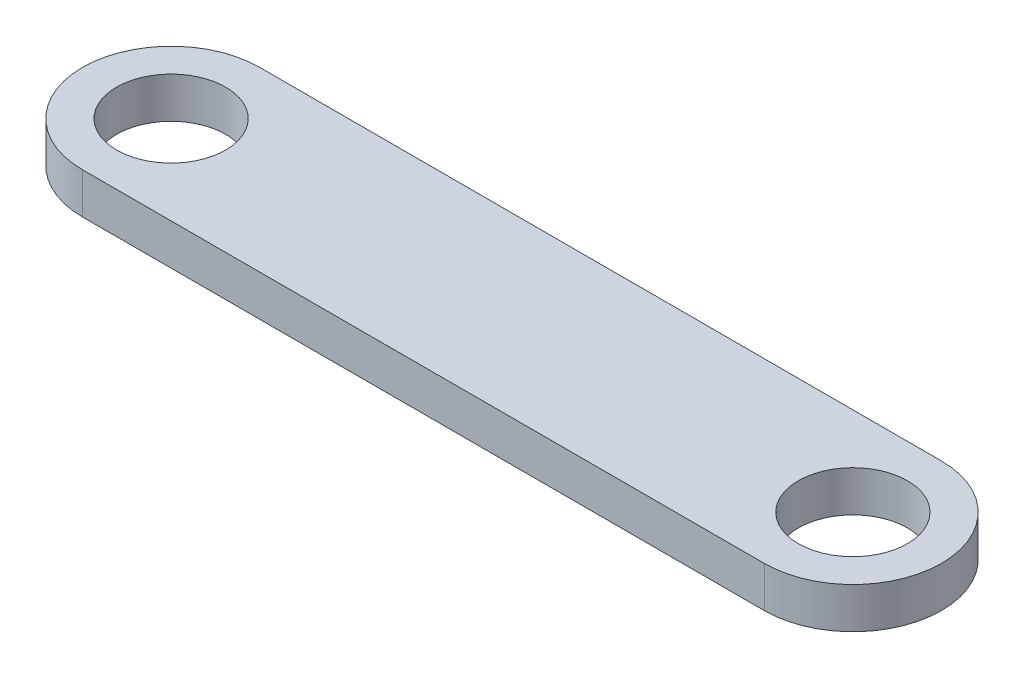
ISO-10303-21;
HEADER;
FILE_DESCRIPTION(('STEP AP214'),'2;1');
FILE_NAME('part.step','',(''),(''),'','','');
FILE_SCHEMA(('AUTOMOTIVE_DESIGN { 1 0 10303 214 1 1 1 1 }'));
ENDSEC;
DATA;
#1=APPLICATION_CONTEXT('core data for automotive mechanical design processes');
#2=APPLICATION_PROTOCOL_DEFINITION('international standard','automotive_design',2000,#1);
#3=PRODUCT_CONTEXT('',#1,'mechanical');
#4=PRODUCT('Part','Part','',(#3));
#5=PRODUCT_RELATED_PRODUCT_CATEGORY('part','',(#4));
#6=PRODUCT_DEFINITION_FORMATION('','',#4);
#7=PRODUCT_DEFINITION_CONTEXT('part definition',#1,'design');
#8=PRODUCT_DEFINITION('design','',#6,#7);
#9=PRODUCT_DEFINITION_SHAPE('','',#8);
#10=(LENGTH_UNIT() NAMED_UNIT(*) SI_UNIT(.MILLI.,.METRE.));
#11=(NAMED_UNIT(*) PLANE_ANGLE_UNIT() SI_UNIT($,.RADIAN.));
#12=(NAMED_UNIT(*) SI_UNIT($,.STERADIAN.) SOLID_ANGLE_UNIT());
#13=UNCERTAINTY_MEASURE_WITH_UNIT(LENGTH_MEASURE(1.E-05),#10,'distance_accuracy_value','');
#14=(GEOMETRIC_REPRESENTATION_CONTEXT(3) GLOBAL_UNCERTAINTY_ASSIGNED_CONTEXT((#13)) GLOBAL_UNIT_ASSIGNED_CONTEXT((#10,
#11,#12)) REPRESENTATION_CONTEXT('',''));
#15=CARTESIAN_POINT('',(0.,0.,0.));
#16=DIRECTION('',(0.,0.,1.));
#17=DIRECTION('',(1.,0.,0.));
#18=AXIS2_PLACEMENT_3D('',#15,#16,#17);
#19=CARTESIAN_POINT('',(-25.,3.,0.));
#20=DIRECTION('',(0.,1.,0.));
#21=DIRECTION('',(0.,0.,1.));
#22=AXIS2_PLACEMENT_3D('',#19,#20,#21);
#23=PLANE('',#22);
#24=CARTESIAN_POINT('',(-25.,3.,0.));
#25=DIRECTION('',(0.,1.,0.));
#26=DIRECTION('',(0.,0.,1.));
#27=AXIS2_PLACEMENT_3D('',#24,#25,#26);
#28=CIRCLE('',#27,4.);
#29=CARTESIAN_POINT('',(-25.,3.,4.));
#30=VERTEX_POINT('',#29);
#31=EDGE_CURVE('E118',#30,#30,#28,.T.);
#32=ORIENTED_EDGE('',*,*,#31,.F.);
#33=EDGE_LOOP('',(#32));
#34=FACE_BOUND('',#33,.T.);
#35=CARTESIAN_POINT('',(-25.,3.,0.));
#36=DIRECTION('',(0.,1.,0.));
#37=DIRECTION('',(0.,0.,1.));
#38=AXIS2_PLACEMENT_3D('',#35,#36,#37);
#39=CIRCLE('',#38,6.5);
#40=CARTESIAN_POINT('',(-25.,3.,-6.5));
#41=VERTEX_POINT('',#40);
#42=CARTESIAN_POINT('',(-25.,3.,6.5));
#43=VERTEX_POINT('',#42);
#44=EDGE_CURVE('E98',#41,#43,#39,.T.);
#45=ORIENTED_EDGE('',*,*,#44,.T.);
#46=DIRECTION('',(1.,0.,0.));
#47=VECTOR('',#46,1.);
#48=CARTESIAN_POINT('',(-25.,3.,6.5));
#49=LINE('',#48,#47);
#50=CARTESIAN_POINT('',(25.,3.,6.49999999999999));
#51=VERTEX_POINT('',#50);
#52=EDGE_CURVE('E93',#43,#51,#49,.T.);
#53=ORIENTED_EDGE('',*,*,#52,.T.);
#54=CARTESIAN_POINT('',(25.,3.,0.));
#55=DIRECTION('',(0.,1.,0.));
#56=DIRECTION('',(0.,0.,1.));
#57=AXIS2_PLACEMENT_3D('',#54,#55,#56);
#58=CIRCLE('',#57,6.5);
#59=CARTESIAN_POINT('',(25.,3.,-6.50000000000001));
#60=VERTEX_POINT('',#59);
#61=EDGE_CURVE('E96',#51,#60,#58,.T.);
#62=ORIENTED_EDGE('',*,*,#61,.T.);
#63=DIRECTION('',(-1.,0.,0.));
#64=VECTOR('',#63,1.);
#65=CARTESIAN_POINT('',(-25.,3.,-6.5));
#66=LINE('',#65,#64);
#67=EDGE_CURVE('E63',#60,#41,#66,.T.);
#68=ORIENTED_EDGE('',*,*,#67,.T.);
#69=EDGE_LOOP('',(#45,#53,#62,#68));
#70=FACE_BOUND('',#69,.T.);
#71=CARTESIAN_POINT('',(25.,3.,0.));
#72=DIRECTION('',(0.,1.,0.));
#73=DIRECTION('',(0.,0.,1.));
#74=AXIS2_PLACEMENT_3D('',#71,#72,#73);
#75=CIRCLE('',#74,4.);
#76=CARTESIAN_POINT('',(25.,3.,3.99999999999999));
#77=VERTEX_POINT('',#76);
#78=EDGE_CURVE('E140',#77,#77,#75,.T.);
#79=ORIENTED_EDGE('',*,*,#78,.F.);
#80=EDGE_LOOP('',(#79));
#81=FACE_BOUND('',#80,.T.);
#82=ADVANCED_FACE('F45',(#34,#70,#81),#23,.T.);
#83=CARTESIAN_POINT('',(-25.,0.,0.));
#84=DIRECTION('',(0.,1.,0.));
#85=DIRECTION('',(0.,0.,1.));
#86=AXIS2_PLACEMENT_3D('',#83,#84,#85);
#87=PLANE('',#86);
#88=CARTESIAN_POINT('',(-25.,0.,0.));
#89=DIRECTION('',(0.,1.,0.));
#90=DIRECTION('',(0.,0.,1.));
#91=AXIS2_PLACEMENT_3D('',#88,#89,#90);
#92=CIRCLE('',#91,6.5);
#93=CARTESIAN_POINT('',(-25.,0.,-6.5));
#94=VERTEX_POINT('',#93);
#95=CARTESIAN_POINT('',(-25.,0.,6.5));
#96=VERTEX_POINT('',#95);
#97=EDGE_CURVE('E114',#94,#96,#92,.T.);
#98=ORIENTED_EDGE('',*,*,#97,.F.);
#99=DIRECTION('',(-1.,0.,0.));
#100=VECTOR('',#99,1.);
#101=CARTESIAN_POINT('',(-25.,0.,-6.5));
#102=LINE('',#101,#100);
#103=CARTESIAN_POINT('',(25.,0.,-6.50000000000001));
#104=VERTEX_POINT('',#103);
#105=EDGE_CURVE('E86',#104,#94,#102,.T.);
#106=ORIENTED_EDGE('',*,*,#105,.F.);
#107=CARTESIAN_POINT('',(25.,0.,0.));
#108=DIRECTION('',(0.,1.,0.));
#109=DIRECTION('',(0.,0.,1.));
#110=AXIS2_PLACEMENT_3D('',#107,#108,#109);
#111=CIRCLE('',#110,6.5);
#112=CARTESIAN_POINT('',(25.,0.,6.49999999999999));
#113=VERTEX_POINT('',#112);
#114=EDGE_CURVE('E80',#113,#104,#111,.T.);
#115=ORIENTED_EDGE('',*,*,#114,.F.);
#116=DIRECTION('',(1.,0.,0.));
#117=VECTOR('',#116,1.);
#118=CARTESIAN_POINT('',(-25.,0.,6.5));
#119=LINE('',#118,#117);
#120=EDGE_CURVE('E103',#96,#113,#119,.T.);
#121=ORIENTED_EDGE('',*,*,#120,.F.);
#122=EDGE_LOOP('',(#98,#106,#115,#121));
#123=FACE_BOUND('',#122,.T.);
#124=CARTESIAN_POINT('',(-25.,0.,0.));
#125=DIRECTION('',(0.,1.,0.));
#126=DIRECTION('',(0.,0.,1.));
#127=AXIS2_PLACEMENT_3D('',#124,#125,#126);
#128=CIRCLE('',#127,4.);
#129=CARTESIAN_POINT('',(-25.,0.,4.));
#130=VERTEX_POINT('',#129);
#131=EDGE_CURVE('E136',#130,#130,#128,.T.);
#132=ORIENTED_EDGE('',*,*,#131,.T.);
#133=EDGE_LOOP('',(#132));
#134=FACE_BOUND('',#133,.T.);
#135=CARTESIAN_POINT('',(25.,0.,0.));
#136=DIRECTION('',(0.,1.,0.));
#137=DIRECTION('',(0.,0.,1.));
#138=AXIS2_PLACEMENT_3D('',#135,#136,#137);
#139=CIRCLE('',#138,4.);
#140=CARTESIAN_POINT('',(25.,0.,3.99999999999999));
#141=VERTEX_POINT('',#140);
#142=EDGE_CURVE('E144',#141,#141,#139,.T.);
#143=ORIENTED_EDGE('',*,*,#142,.T.);
#144=EDGE_LOOP('',(#143));
#145=FACE_BOUND('',#144,.T.);
#146=ADVANCED_FACE('F131',(#123,#134,#145),#87,.F.);
#147=CARTESIAN_POINT('',(-25.,3.,0.));
#148=DIRECTION('',(0.,-1.,0.));
#149=DIRECTION('',(0.,0.,-1.));
#150=AXIS2_PLACEMENT_3D('',#147,#148,#149);
#151=CYLINDRICAL_SURFACE('',#150,6.5);
#152=ORIENTED_EDGE('',*,*,#97,.T.);
#153=DIRECTION('',(0.,-1.,0.));
#154=VECTOR('',#153,1.);
#155=CARTESIAN_POINT('',(-25.,3.,6.5));
#156=LINE('',#155,#154);
#157=EDGE_CURVE('E11',#43,#96,#156,.T.);
#158=ORIENTED_EDGE('',*,*,#157,.F.);
#159=ORIENTED_EDGE('',*,*,#44,.F.);
#160=DIRECTION('',(0.,-1.,0.));
#161=VECTOR('',#160,1.);
#162=CARTESIAN_POINT('',(-25.,3.,-6.5));
#163=LINE('',#162,#161);
#164=EDGE_CURVE('E110',#41,#94,#163,.T.);
#165=ORIENTED_EDGE('',*,*,#164,.T.);
#166=EDGE_LOOP('',(#152,#158,#159,#165));
#167=FACE_BOUND('',#166,.T.);
#168=ADVANCED_FACE('F47',(#167),#151,.T.);
#169=CARTESIAN_POINT('',(-25.,3.,6.5));
#170=DIRECTION('',(0.,0.,-1.));
#171=DIRECTION('',(-1.,0.,0.));
#172=AXIS2_PLACEMENT_3D('',#169,#170,#171);
#173=PLANE('',#172);
#174=ORIENTED_EDGE('',*,*,#120,.T.);
#175=DIRECTION('',(0.,-1.,0.));
#176=VECTOR('',#175,1.);
#177=CARTESIAN_POINT('',(25.,3.,6.49999999999999));
#178=LINE('',#177,#176);
#179=EDGE_CURVE('E55',#51,#113,#178,.T.);
#180=ORIENTED_EDGE('',*,*,#179,.F.);
#181=ORIENTED_EDGE('',*,*,#52,.F.);
#182=ORIENTED_EDGE('',*,*,#157,.T.);
#183=EDGE_LOOP('',(#174,#180,#181,#182));
#184=FACE_BOUND('',#183,.T.);
#185=ADVANCED_FACE('F102',(#184),#173,.F.);
#186=CARTESIAN_POINT('',(25.,3.,0.));
#187=DIRECTION('',(0.,-1.,0.));
#188=DIRECTION('',(0.,0.,-1.));
#189=AXIS2_PLACEMENT_3D('',#186,#187,#188);
#190=CYLINDRICAL_SURFACE('',#189,6.5);
#191=ORIENTED_EDGE('',*,*,#114,.T.);
#192=DIRECTION('',(0.,-1.,0.));
#193=VECTOR('',#192,1.);
#194=CARTESIAN_POINT('',(25.,3.,-6.50000000000001));
#195=LINE('',#194,#193);
#196=EDGE_CURVE('E105',#60,#104,#195,.T.);
#197=ORIENTED_EDGE('',*,*,#196,.F.);
#198=ORIENTED_EDGE('',*,*,#61,.F.);
#199=ORIENTED_EDGE('',*,*,#179,.T.);
#200=EDGE_LOOP('',(#191,#197,#198,#199));
#201=FACE_BOUND('',#200,.T.);
#202=ADVANCED_FACE('F106',(#201),#190,.T.);
#203=CARTESIAN_POINT('',(-25.,3.,-6.5));
#204=DIRECTION('',(0.,0.,1.));
#205=DIRECTION('',(1.,0.,0.));
#206=AXIS2_PLACEMENT_3D('',#203,#204,#205);
#207=PLANE('',#206);
#208=ORIENTED_EDGE('',*,*,#105,.T.);
#209=ORIENTED_EDGE('',*,*,#164,.F.);
#210=ORIENTED_EDGE('',*,*,#67,.F.);
#211=ORIENTED_EDGE('',*,*,#196,.T.);
#212=EDGE_LOOP('',(#208,#209,#210,#211));
#213=FACE_BOUND('',#212,.T.);
#214=ADVANCED_FACE('F128',(#213),#207,.F.);
#215=CARTESIAN_POINT('',(-25.,3.,0.));
#216=DIRECTION('',(0.,-1.,0.));
#217=DIRECTION('',(0.,0.,-1.));
#218=AXIS2_PLACEMENT_3D('',#215,#216,#217);
#219=CYLINDRICAL_SURFACE('',#218,4.);
#220=ORIENTED_EDGE('',*,*,#31,.T.);
#221=EDGE_LOOP('',(#220));
#222=FACE_BOUND('',#221,.T.);
#223=ORIENTED_EDGE('',*,*,#131,.F.);
#224=EDGE_LOOP('',(#223));
#225=FACE_BOUND('',#224,.T.);
#226=ADVANCED_FACE('F163',(#222,#225),#219,.F.);
#227=CARTESIAN_POINT('',(25.,3.,0.));
#228=DIRECTION('',(0.,-1.,0.));
#229=DIRECTION('',(0.,0.,-1.));
#230=AXIS2_PLACEMENT_3D('',#227,#228,#229);
#231=CYLINDRICAL_SURFACE('',#230,4.);
#232=ORIENTED_EDGE('',*,*,#78,.T.);
#233=EDGE_LOOP('',(#232));
#234=FACE_BOUND('',#233,.T.);
#235=ORIENTED_EDGE('',*,*,#142,.F.);
#236=EDGE_LOOP('',(#235));
#237=FACE_BOUND('',#236,.T.);
#238=ADVANCED_FACE('F152',(#234,#237),#231,.F.);
#239=CLOSED_SHELL('',(#82,#146,#168,#185,#202,#214,#226,#238));
#240=MANIFOLD_SOLID_BREP('B2',#239);
#241=ADVANCED_BREP_SHAPE_REPRESENTATION('',(#18,#240),#14);
#242=SHAPE_DEFINITION_REPRESENTATION(#9,#241);
ENDSEC;
END-ISO-10303-21;
